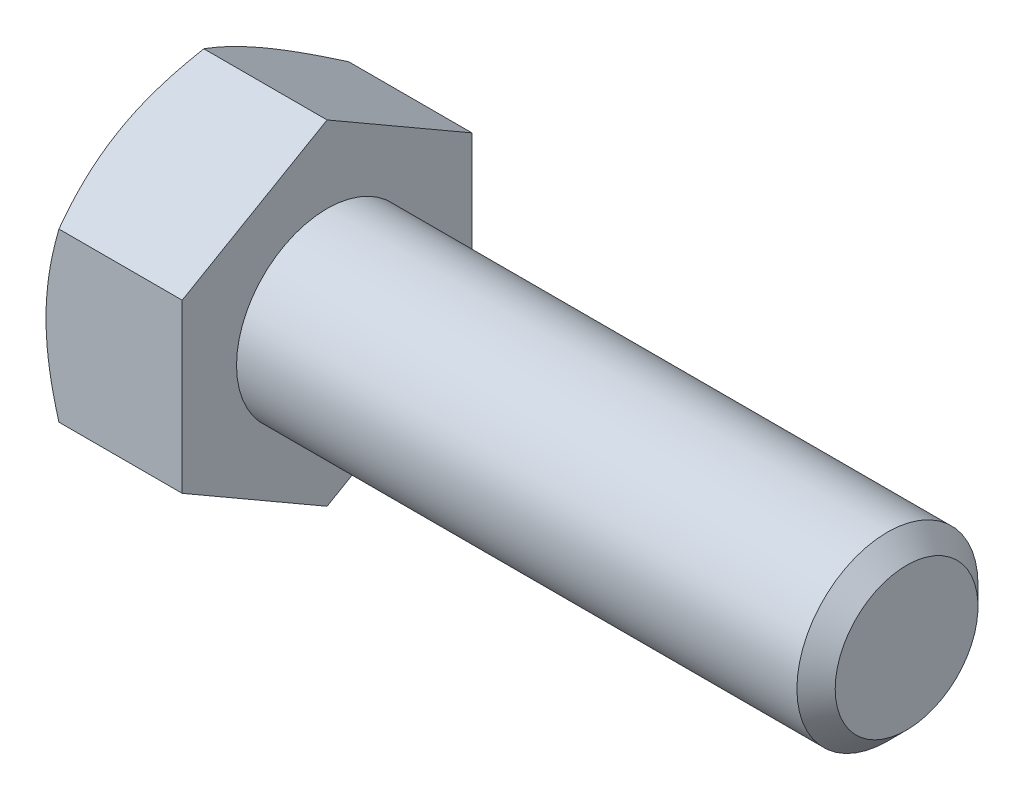
ISO-10303-21;
HEADER;
FILE_DESCRIPTION(('STEP AP214'),'2;1');
FILE_NAME('part.step','',(''),(''),'','','');
FILE_SCHEMA(('AUTOMOTIVE_DESIGN { 1 0 10303 214 1 1 1 1 }'));
ENDSEC;
DATA;
#1=APPLICATION_CONTEXT('core data for automotive mechanical design processes');
#2=APPLICATION_PROTOCOL_DEFINITION('international standard','automotive_design',2000,#1);
#3=PRODUCT_CONTEXT('',#1,'mechanical');
#4=PRODUCT('Part','Part','',(#3));
#5=PRODUCT_RELATED_PRODUCT_CATEGORY('part','',(#4));
#6=PRODUCT_DEFINITION_FORMATION('','',#4);
#7=PRODUCT_DEFINITION_CONTEXT('part definition',#1,'design');
#8=PRODUCT_DEFINITION('design','',#6,#7);
#9=PRODUCT_DEFINITION_SHAPE('','',#8);
#10=(LENGTH_UNIT() NAMED_UNIT(*) SI_UNIT(.MILLI.,.METRE.));
#11=(NAMED_UNIT(*) PLANE_ANGLE_UNIT() SI_UNIT($,.RADIAN.));
#12=(NAMED_UNIT(*) SI_UNIT($,.STERADIAN.) SOLID_ANGLE_UNIT());
#13=UNCERTAINTY_MEASURE_WITH_UNIT(LENGTH_MEASURE(1.E-05),#10,'distance_accuracy_value','');
#14=(GEOMETRIC_REPRESENTATION_CONTEXT(3) GLOBAL_UNCERTAINTY_ASSIGNED_CONTEXT((#13)) GLOBAL_UNIT_ASSIGNED_CONTEXT((#10,
#11,#12)) REPRESENTATION_CONTEXT('',''));
#15=CARTESIAN_POINT('',(0.,0.,0.));
#16=DIRECTION('',(0.,0.,1.));
#17=DIRECTION('',(1.,0.,0.));
#18=AXIS2_PLACEMENT_3D('',#15,#16,#17);
#19=CARTESIAN_POINT('',(5.969,3.66617420935411,-6.34999999999999));
#20=DIRECTION('',(0.,-0.866025403784438,0.500000000000001));
#21=DIRECTION('',(0.,-0.500000000000001,-0.866025403784438));
#22=AXIS2_PLACEMENT_3D('',#19,#20,#21);
#23=PLANE('',#22);
#24=CARTESIAN_POINT('',(0.567225792220655,7.3324638887621,0.000200000000005751));
#25=CARTESIAN_POINT('',(0.520705795885485,7.25187715009446,-0.13938032578861));
#26=CARTESIAN_POINT('',(0.476297032585866,7.17098994497989,-0.279481074729283));
#27=CARTESIAN_POINT('',(0.39228345045239,7.00855864282176,-0.560820342806721));
#28=CARTESIAN_POINT('',(0.352680703976118,6.92701427845871,-0.702059324954447));
#29=CARTESIAN_POINT('',(0.24185882380987,6.68107555195828,-1.12803769480198));
#30=CARTESIAN_POINT('',(0.178824482202445,6.51571038378532,-1.4144585678797));
#31=CARTESIAN_POINT('',(0.104909071695572,6.26824441683673,-1.84308219577881));
#32=CARTESIAN_POINT('',(0.0838526679332001,6.18688302502749,-1.98400426016694));
#33=CARTESIAN_POINT('',(0.0485440446617486,6.02379260806586,-2.26648514857208));
#34=CARTESIAN_POINT('',(0.0342912239672174,5.94206361604021,-2.40804391521191));
#35=CARTESIAN_POINT('',(0.0129530042780789,5.77846368249352,-2.69140731222965));
#36=CARTESIAN_POINT('',(0.00585947102328577,5.69659300817866,-2.83321147979292));
#37=CARTESIAN_POINT('',(-0.00101567917148399,5.53278054688489,-3.11694298566664));
#38=CARTESIAN_POINT('',(-0.000797521989079379,5.45083876218098,-3.2588703200367));
#39=CARTESIAN_POINT('',(0.00985057652705687,5.22634399461134,-3.6477066635007));
#40=CARTESIAN_POINT('',(0.0277266404085307,5.08386449580427,-3.89448839447146));
#41=CARTESIAN_POINT('',(0.0844122058574213,4.79985183690217,-4.38641274968261));
#42=CARTESIAN_POINT('',(0.123241082865863,4.65831967566048,-4.63155364385825));
#43=CARTESIAN_POINT('',(0.220302170250005,4.37373542545026,-5.12446802425624));
#44=CARTESIAN_POINT('',(0.278945624959315,4.23071924628531,-5.37217931287431));
#45=CARTESIAN_POINT('',(0.412042668710679,3.94681968285054,-5.86390778098996));
#46=CARTESIAN_POINT('',(0.486464993107676,3.80593266266769,-6.10793125807364));
#47=CARTESIAN_POINT('',(0.567225792220648,3.66605873930029,-6.3502));
#48=B_SPLINE_CURVE_WITH_KNOTS('',3,(#24,#25,#26,#27,#28,#29,#30,#31,#32,#33,#34,#35,#36,#37,#38,
#39,#40,#41,#42,#43,#44,#45,#46,#47),.UNSPECIFIED.,.F.,.F.,(4,2,2,2,2,2,2,2,2,2,2,4),(0.,
0.503218195050233,1.00665261286994,2.01561339063537,2.507736941055,2.99981699787609,
3.49133733019736,3.98284247815861,4.83850206575153,5.69495425638524,6.57040160519866,
7.44413026658514),.UNSPECIFIED.);
#49=CARTESIAN_POINT('',(0.56715912397921,7.33234841870825,0.));
#50=VERTEX_POINT('',#49);
#51=CARTESIAN_POINT('',(0.,5.49926131403117,-3.17500000000001));
#52=VERTEX_POINT('',#51);
#53=EDGE_CURVE('E63',#50,#52,#48,.T.);
#54=ORIENTED_EDGE('',*,*,#53,.F.);
#55=DIRECTION('',(-1.,0.,0.));
#56=VECTOR('',#55,1.);
#57=CARTESIAN_POINT('',(5.969,7.33234841870825,0.));
#58=LINE('',#57,#56);
#59=CARTESIAN_POINT('',(5.969,7.33234841870825,0.));
#60=VERTEX_POINT('',#59);
#61=EDGE_CURVE('E159',#60,#50,#58,.T.);
#62=ORIENTED_EDGE('',*,*,#61,.F.);
#63=DIRECTION('',(0.,0.500000000000001,0.866025403784438));
#64=VECTOR('',#63,1.);
#65=CARTESIAN_POINT('',(5.969,3.66617420935411,-6.34999999999999));
#66=LINE('',#65,#64);
#67=CARTESIAN_POINT('',(5.969,3.66617420935411,-6.34999999999999));
#68=VERTEX_POINT('',#67);
#69=EDGE_CURVE('E250',#68,#60,#66,.T.);
#70=ORIENTED_EDGE('',*,*,#69,.F.);
#71=DIRECTION('',(-1.,0.,0.));
#72=VECTOR('',#71,1.);
#73=CARTESIAN_POINT('',(5.969,3.66617420935411,-6.34999999999999));
#74=LINE('',#73,#72);
#75=CARTESIAN_POINT('',(0.567159123979203,3.66617420935411,-6.34999999999999));
#76=VERTEX_POINT('',#75);
#77=EDGE_CURVE('E147',#68,#76,#74,.T.);
#78=ORIENTED_EDGE('',*,*,#77,.T.);
#79=EDGE_CURVE('E141',#52,#76,#48,.T.);
#80=ORIENTED_EDGE('',*,*,#79,.F.);
#81=EDGE_LOOP('',(#54,#62,#70,#78,#80));
#82=FACE_BOUND('',#81,.T.);
#83=ADVANCED_FACE('F47',(#82),#23,.F.);
#84=CARTESIAN_POINT('',(5.969,7.33234841870825,0.));
#85=DIRECTION('',(0.,-0.866025403784438,-0.500000000000001));
#86=DIRECTION('',(0.,0.500000000000001,-0.866025403784438));
#87=AXIS2_PLACEMENT_3D('',#84,#85,#86);
#88=PLANE('',#87);
#89=CARTESIAN_POINT('',(0.567225792220651,3.66605873930029,6.3502));
#90=CARTESIAN_POINT('',(0.520705795885481,3.74664547796792,6.21061967421138));
#91=CARTESIAN_POINT('',(0.476297032585862,3.82753268308249,6.0705189252707));
#92=CARTESIAN_POINT('',(0.392283450452386,3.98996398524061,5.78917965719326));
#93=CARTESIAN_POINT('',(0.352680703976115,4.07150834960367,5.64794067504554));
#94=CARTESIAN_POINT('',(0.241858823809868,4.3174470761041,5.22196230519801));
#95=CARTESIAN_POINT('',(0.178824482202444,4.48281224427705,4.93554143212029));
#96=CARTESIAN_POINT('',(0.104909071695573,4.73027821122564,4.50691780422117));
#97=CARTESIAN_POINT('',(0.0838526679332012,4.81163960303488,4.36599573983304));
#98=CARTESIAN_POINT('',(0.0485440446617505,4.97473001999651,4.0835148514279));
#99=CARTESIAN_POINT('',(0.03429122396722,5.05645901202217,3.94195608478808));
#100=CARTESIAN_POINT('',(0.0129530042780825,5.22005894556885,3.65859268777033));
#101=CARTESIAN_POINT('',(0.00585947102328984,5.30192961988371,3.51678852020706));
#102=CARTESIAN_POINT('',(-0.00101567917148005,5.46574208117748,3.23305701433335));
#103=CARTESIAN_POINT('',(-0.000797521989076034,5.5476838658814,3.09112967996329));
#104=CARTESIAN_POINT('',(0.00985057652706057,5.77217863345105,2.7022933364993));
#105=CARTESIAN_POINT('',(0.0277266404085369,5.91465813225811,2.45551160552852));
#106=CARTESIAN_POINT('',(0.0844122058574301,6.1986707911602,1.96358725031737));
#107=CARTESIAN_POINT('',(0.123241082865872,6.34020295240189,1.71844635614173));
#108=CARTESIAN_POINT('',(0.220302170250014,6.62478720261211,1.22553197574374));
#109=CARTESIAN_POINT('',(0.278945624959325,6.76780338177705,0.977820687125676));
#110=CARTESIAN_POINT('',(0.412042668710689,7.05170294521183,0.486092219010024));
#111=CARTESIAN_POINT('',(0.486464993107686,7.19258996539468,0.242068741926349));
#112=CARTESIAN_POINT('',(0.567225792220655,7.3324638887621,-0.000200000000005751));
#113=B_SPLINE_CURVE_WITH_KNOTS('',3,(#89,#90,#91,#92,#93,#94,#95,#96,#97,#98,#99,#100,#101,#102,
#103,#104,#105,#106,#107,#108,#109,#110,#111,#112),.UNSPECIFIED.,.F.,.F.,(4,2,2,2,2,2,2,2,2,2,2,
4),(0.,0.503218195050233,1.00665261286994,2.01561339063537,2.507736941055,2.99981699787609,
3.49133733019736,3.98284247815861,4.83850206575153,5.69495425638524,6.57040160519865,
7.44413026658514),.UNSPECIFIED.);
#114=CARTESIAN_POINT('',(0.567159123979206,3.66617420935411,6.34999999999999));
#115=VERTEX_POINT('',#114);
#116=CARTESIAN_POINT('',(0.,5.49926131403117,3.17500000000001));
#117=VERTEX_POINT('',#116);
#118=EDGE_CURVE('E70',#115,#117,#113,.T.);
#119=ORIENTED_EDGE('',*,*,#118,.F.);
#120=DIRECTION('',(-1.,0.,0.));
#121=VECTOR('',#120,1.);
#122=CARTESIAN_POINT('',(5.969,3.66617420935411,6.34999999999999));
#123=LINE('',#122,#121);
#124=CARTESIAN_POINT('',(5.969,3.66617420935411,6.34999999999999));
#125=VERTEX_POINT('',#124);
#126=EDGE_CURVE('E157',#125,#115,#123,.T.);
#127=ORIENTED_EDGE('',*,*,#126,.F.);
#128=DIRECTION('',(0.,-0.500000000000001,0.866025403784438));
#129=VECTOR('',#128,1.);
#130=CARTESIAN_POINT('',(5.969,7.33234841870825,0.));
#131=LINE('',#130,#129);
#132=EDGE_CURVE('E248',#60,#125,#131,.T.);
#133=ORIENTED_EDGE('',*,*,#132,.F.);
#134=ORIENTED_EDGE('',*,*,#61,.T.);
#135=EDGE_CURVE('E174',#117,#50,#113,.T.);
#136=ORIENTED_EDGE('',*,*,#135,.F.);
#137=EDGE_LOOP('',(#119,#127,#133,#134,#136));
#138=FACE_BOUND('',#137,.T.);
#139=ADVANCED_FACE('F180',(#138),#88,.F.);
#140=CARTESIAN_POINT('',(5.969,3.66617420935411,6.34999999999999));
#141=DIRECTION('',(0.,0.,-1.));
#142=DIRECTION('',(-1.,0.,0.));
#143=AXIS2_PLACEMENT_3D('',#140,#141,#142);
#144=PLANE('',#143);
#145=CARTESIAN_POINT('',(3.14367601755405,-9.93980283198639,6.34999999999999));
#146=CARTESIAN_POINT('',(3.00837198029773,-9.66163438687442,6.34999999999999));
#147=CARTESIAN_POINT('',(2.87433908027309,-9.3828371073051,6.34999999999999));
#148=CARTESIAN_POINT('',(2.60952879037523,-8.8236507491173,6.34999999999999));
#149=CARTESIAN_POINT('',(2.4787518963537,-8.54326143593897,6.34999999999999));
#150=CARTESIAN_POINT('',(2.22052868772129,-7.97915634696427,6.34999999999999));
#151=CARTESIAN_POINT('',(2.09310359186349,-7.695430825227,6.34999999999999));
#152=CARTESIAN_POINT('',(1.84334767414879,-7.12575465379769,6.34999999999999));
#153=CARTESIAN_POINT('',(1.72101661744909,-6.83980410740554,6.34999999999999));
#154=CARTESIAN_POINT('',(1.47885197386771,-6.2557230270762,6.34999999999999));
#155=CARTESIAN_POINT('',(1.35923464654653,-5.9575023498181,6.34999999999999));
#156=CARTESIAN_POINT('',(1.12883238942455,-5.357606094795,6.34999999999999));
#157=CARTESIAN_POINT('',(1.01804843752938,-5.05593013872692,6.34999999999999));
#158=CARTESIAN_POINT('',(0.808153098255225,-4.44917964545297,6.34999999999999));
#159=CARTESIAN_POINT('',(0.709018875842442,-4.14411308466492,6.34999999999999));
#160=CARTESIAN_POINT('',(0.525543834192884,-3.52960171995186,6.34999999999999));
#161=CARTESIAN_POINT('',(0.441198453590938,-3.22015829792944,6.34999999999999));
#162=CARTESIAN_POINT('',(0.291727586386876,-2.59842911342063,6.34999999999999));
#163=CARTESIAN_POINT('',(0.226496888329708,-2.2861690499431,6.34999999999999));
#164=CARTESIAN_POINT('',(0.118904571828099,-1.65762730788837,6.34999999999999));
#165=CARTESIAN_POINT('',(0.0765405573459571,-1.34134605421932,6.34999999999999));
#166=CARTESIAN_POINT('',(0.0329533459299324,-0.867275016888791,6.34999999999999));
#167=CARTESIAN_POINT('',(0.0217606490874758,-0.710363798925241,6.34999999999999));
#168=CARTESIAN_POINT('',(0.00601970866107996,-0.396201526465927,6.34999999999999));
#169=CARTESIAN_POINT('',(0.00147135206032945,-0.238950477796076,6.34999999999999));
#170=CARTESIAN_POINT('',(-0.000864873693707638,0.0756024820110111,6.34999999999999));
#171=CARTESIAN_POINT('',(0.00134730804231018,0.2329043935222,6.34999999999999));
#172=CARTESIAN_POINT('',(0.0124750937047321,0.547273259965611,6.34999999999999));
#173=CARTESIAN_POINT('',(0.0213910154873183,0.704340203403037,6.34999999999999));
#174=CARTESIAN_POINT('',(0.0504634057547403,1.07899586027898,6.34999999999999));
#175=CARTESIAN_POINT('',(0.073643623882215,1.2963550957377,6.34999999999999));
#176=CARTESIAN_POINT('',(0.13159960434819,1.72951065205878,6.34999999999999));
#177=CARTESIAN_POINT('',(0.166376861833684,1.94530676772894,6.34999999999999));
#178=CARTESIAN_POINT('',(0.286264257854856,2.59006925980297,6.34999999999999));
#179=CARTESIAN_POINT('',(0.386910475193505,3.01618787228098,6.34999999999999));
#180=CARTESIAN_POINT('',(0.562116784628249,3.65361272982345,6.34999999999999));
#181=CARTESIAN_POINT('',(0.625415304913837,3.86820484032542,6.34999999999999));
#182=CARTESIAN_POINT('',(0.758751353425599,4.29530575657379,6.34999999999999));
#183=CARTESIAN_POINT('',(0.828788931820656,4.50781454679793,6.34999999999999));
#184=CARTESIAN_POINT('',(0.974465563814957,4.93081468737569,6.34999999999999));
#185=CARTESIAN_POINT('',(1.05010294252176,5.14130661986484,6.34999999999999));
#186=CARTESIAN_POINT('',(1.20607264760708,5.56053331579619,6.34999999999999));
#187=CARTESIAN_POINT('',(1.28640487799369,5.76926811506533,6.34999999999999));
#188=CARTESIAN_POINT('',(1.50347781751132,6.31783828344512,6.34999999999999));
#189=CARTESIAN_POINT('',(1.64351404320344,6.65636817400485,6.34999999999999));
#190=CARTESIAN_POINT('',(1.93147973510731,7.33006601753897,6.34999999999999));
#191=CARTESIAN_POINT('',(2.07940998438119,7.66523363305403,6.34999999999999));
#192=CARTESIAN_POINT('',(2.38134633815376,8.33295246114881,6.34999999999999));
#193=CARTESIAN_POINT('',(2.53535453751782,8.66550272340177,6.34999999999999));
#194=CARTESIAN_POINT('',(2.84803388547347,9.32838207907316,6.34999999999999));
#195=CARTESIAN_POINT('',(3.00670486567662,9.65871125217437,6.34999999999999));
#196=CARTESIAN_POINT('',(3.32795966755859,10.3180684957328,6.34999999999999));
#197=CARTESIAN_POINT('',(3.49054898052716,10.6470938852597,6.34999999999999));
#198=CARTESIAN_POINT('',(3.81866781799735,11.3036759425,6.34999999999999));
#199=CARTESIAN_POINT('',(3.98419736411603,11.6312325993929,6.34999999999999));
#200=CARTESIAN_POINT('',(4.31759864974134,12.2850676249536,6.34999999999999));
#201=CARTESIAN_POINT('',(4.485469913239,12.6113462366288,6.34999999999999));
#202=CARTESIAN_POINT('',(4.82315890277016,13.2628952011191,6.34999999999999));
#203=CARTESIAN_POINT('',(4.99297663652367,13.5881655499287,6.34999999999999));
#204=CARTESIAN_POINT('',(5.47018031685674,14.4967378639502,6.34999999999999));
#205=CARTESIAN_POINT('',(5.77935148177737,15.0791020152927,6.34999999999999));
#206=CARTESIAN_POINT('',(6.40147296847068,16.2418453877031,6.34999999999999));
#207=CARTESIAN_POINT('',(6.71442349983111,16.8222244963774,6.34999999999999));
#208=CARTESIAN_POINT('',(7.34215184678352,17.9796171047036,6.34999999999999));
#209=CARTESIAN_POINT('',(7.65692074956546,18.5566354431591,6.34999999999999));
#210=CARTESIAN_POINT('',(8.28862904640648,19.7094283212459,6.34999999999999));
#211=CARTESIAN_POINT('',(8.60556827976312,20.2852029489025,6.34999999999999));
#212=CARTESIAN_POINT('',(8.92329906980365,20.8605372016132,6.34999999999999));
#213=B_SPLINE_CURVE_WITH_KNOTS('',3,(#145,#146,#147,#148,#149,#150,#151,#152,#153,#154,#155,
#156,#157,#158,#159,#160,#161,#162,#163,#164,#165,#166,#167,#168,#169,#170,#171,#172,#173,#174,
#175,#176,#177,#178,#179,#180,#181,#182,#183,#184,#185,#186,#187,#188,#189,#190,#191,#192,#193,
#194,#195,#196,#197,#198,#199,#200,#201,#202,#203,#204,#205,#206,#207,#208,#209,#210,#211,#212),
.UNSPECIFIED.,.F.,.F.,(4,2,2,2,2,2,2,2,2,2,2,2,2,2,2,2,2,2,2,2,2,2,2,2,2,2,2,2,2,2,2,2,2,4),(0.,
0.92800002577165,1.85614052122796,2.78917912474405,3.72217466606163,4.68601414241722,
5.64996017364174,6.61198406033347,7.57371070325733,8.53003982946587,9.48626872926092,
9.95807916799837,10.4298815813894,10.9016875462366,11.3735158830582,12.0289230702765,
12.6844147884824,13.9960635141582,14.6672040909619,15.338349664455,16.0092953039748,
16.6802272299963,17.7791313314936,18.8781446441682,19.9775401158916,21.0768959334804,
22.1778940812193,23.2789003270287,24.379685937715,25.480475915801,27.4584871219283,
29.4366085285952,31.408472007269,33.380191024666),.UNSPECIFIED.);
#214=CARTESIAN_POINT('',(0.567159123979206,-3.66617420935411,6.34999999999999));
#215=VERTEX_POINT('',#214);
#216=CARTESIAN_POINT('',(0.,0.,6.34999999999999));
#217=VERTEX_POINT('',#216);
#218=EDGE_CURVE('E260',#215,#217,#213,.T.);
#219=ORIENTED_EDGE('',*,*,#218,.F.);
#220=DIRECTION('',(-1.,0.,0.));
#221=VECTOR('',#220,1.);
#222=CARTESIAN_POINT('',(5.969,-3.66617420935411,6.34999999999999));
#223=LINE('',#222,#221);
#224=CARTESIAN_POINT('',(5.969,-3.66617420935411,6.34999999999999));
#225=VERTEX_POINT('',#224);
#226=EDGE_CURVE('E149',#225,#215,#223,.T.);
#227=ORIENTED_EDGE('',*,*,#226,.F.);
#228=DIRECTION('',(0.,-1.,0.));
#229=VECTOR('',#228,1.);
#230=CARTESIAN_POINT('',(5.969,3.66617420935411,6.34999999999999));
#231=LINE('',#230,#229);
#232=EDGE_CURVE('E244',#125,#225,#231,.T.);
#233=ORIENTED_EDGE('',*,*,#232,.F.);
#234=ORIENTED_EDGE('',*,*,#126,.T.);
#235=EDGE_CURVE('E198',#217,#115,#213,.T.);
#236=ORIENTED_EDGE('',*,*,#235,.F.);
#237=EDGE_LOOP('',(#219,#227,#233,#234,#236));
#238=FACE_BOUND('',#237,.T.);
#239=ADVANCED_FACE('F266',(#238),#144,.F.);
#240=CARTESIAN_POINT('',(5.969,-7.33234841870825,0.));
#241=DIRECTION('',(0.,0.866025403784437,-0.500000000000002));
#242=DIRECTION('',(0.,0.500000000000002,0.866025403784438));
#243=AXIS2_PLACEMENT_3D('',#240,#241,#242);
#244=PLANE('',#243);
#245=CARTESIAN_POINT('',(0.567225792220658,-7.3324638887621,-0.000200000000005751));
#246=CARTESIAN_POINT('',(0.520705795885488,-7.25187715009446,0.139380325788611));
#247=CARTESIAN_POINT('',(0.476297032585869,-7.17098994497989,0.279481074729286));
#248=CARTESIAN_POINT('',(0.392283450452392,-7.00855864282177,0.560820342806725));
#249=CARTESIAN_POINT('',(0.35268070397612,-6.92701427845871,0.702059324954451));
#250=CARTESIAN_POINT('',(0.241858823809873,-6.68107555195828,1.12803769480198));
#251=CARTESIAN_POINT('',(0.178824482202448,-6.51571038378533,1.4144585678797));
#252=CARTESIAN_POINT('',(0.104909071695575,-6.26824441683674,1.84308219577882));
#253=CARTESIAN_POINT('',(0.0838526679332025,-6.1868830250275,1.98400426016694));
#254=CARTESIAN_POINT('',(0.048544044661751,-6.02379260806586,2.26648514857208));
#255=CARTESIAN_POINT('',(0.0342912239672204,-5.94206361604021,2.40804391521191));
#256=CARTESIAN_POINT('',(0.0129530042780814,-5.77846368249352,2.69140731222966));
#257=CARTESIAN_POINT('',(0.00585947102328738,-5.69659300817866,2.83321147979292));
#258=CARTESIAN_POINT('',(-0.00101567917148209,-5.53278054688489,3.11694298566664));
#259=CARTESIAN_POINT('',(-0.000797521989076305,-5.45083876218098,3.2588703200367));
#260=CARTESIAN_POINT('',(0.00985057652706104,-5.22634399461134,3.6477066635007));
#261=CARTESIAN_POINT('',(0.0277266404085333,-5.08386449580427,3.89448839447146));
#262=CARTESIAN_POINT('',(0.0844122058574222,-4.79985183690217,4.38641274968261));
#263=CARTESIAN_POINT('',(0.123241082865864,-4.65831967566048,4.63155364385826));
#264=CARTESIAN_POINT('',(0.220302170250005,-4.37373542545026,5.12446802425625));
#265=CARTESIAN_POINT('',(0.278945624959315,-4.23071924628532,5.37217931287431));
#266=CARTESIAN_POINT('',(0.41204266871068,-3.94681968285054,5.86390778098996));
#267=CARTESIAN_POINT('',(0.486464993107677,-3.80593266266769,6.10793125807364));
#268=CARTESIAN_POINT('',(0.567225792220651,-3.66605873930029,6.3502));
#269=B_SPLINE_CURVE_WITH_KNOTS('',3,(#245,#246,#247,#248,#249,#250,#251,#252,#253,#254,#255,
#256,#257,#258,#259,#260,#261,#262,#263,#264,#265,#266,#267,#268),.UNSPECIFIED.,.F.,.F.,(4,2,2,
2,2,2,2,2,2,2,2,4),(0.,0.503218195050234,1.00665261286995,2.01561339063537,2.507736941055,
2.99981699787609,3.49133733019736,3.98284247815861,4.83850206575153,5.69495425638524,
6.57040160519865,7.44413026658514),.UNSPECIFIED.);
#270=CARTESIAN_POINT('',(0.567159123979213,-7.33234841870825,0.));
#271=VERTEX_POINT('',#270);
#272=CARTESIAN_POINT('',(0.,-5.49926131403117,3.17500000000001));
#273=VERTEX_POINT('',#272);
#274=EDGE_CURVE('E182',#271,#273,#269,.T.);
#275=ORIENTED_EDGE('',*,*,#274,.F.);
#276=DIRECTION('',(-1.,0.,0.));
#277=VECTOR('',#276,1.);
#278=CARTESIAN_POINT('',(5.969,-7.33234841870825,0.));
#279=LINE('',#278,#277);
#280=CARTESIAN_POINT('',(5.969,-7.33234841870825,0.));
#281=VERTEX_POINT('',#280);
#282=EDGE_CURVE('E146',#281,#271,#279,.T.);
#283=ORIENTED_EDGE('',*,*,#282,.F.);
#284=DIRECTION('',(0.,-0.500000000000002,-0.866025403784437));
#285=VECTOR('',#284,1.);
#286=CARTESIAN_POINT('',(5.969,-7.33234841870825,0.));
#287=LINE('',#286,#285);
#288=EDGE_CURVE('E242',#225,#281,#287,.T.);
#289=ORIENTED_EDGE('',*,*,#288,.F.);
#290=ORIENTED_EDGE('',*,*,#226,.T.);
#291=EDGE_CURVE('E184',#273,#215,#269,.T.);
#292=ORIENTED_EDGE('',*,*,#291,.F.);
#293=EDGE_LOOP('',(#275,#283,#289,#290,#292));
#294=FACE_BOUND('',#293,.T.);
#295=ADVANCED_FACE('F238',(#294),#244,.F.);
#296=CARTESIAN_POINT('',(5.969,-3.66617420935414,-6.34999999999999));
#297=DIRECTION('',(0.,0.866025403784438,0.500000000000001));
#298=DIRECTION('',(0.,-0.500000000000001,0.866025403784438));
#299=AXIS2_PLACEMENT_3D('',#296,#297,#298);
#300=PLANE('',#299);
#301=CARTESIAN_POINT('',(0.567225792220655,-3.66605873930029,-6.3502));
#302=CARTESIAN_POINT('',(0.520705795885487,-3.74664547796793,-6.21061967421138));
#303=CARTESIAN_POINT('',(0.476297032585869,-3.8275326830825,-6.07051892527071));
#304=CARTESIAN_POINT('',(0.392283450452394,-3.98996398524062,-5.78917965719327));
#305=CARTESIAN_POINT('',(0.352680703976123,-4.07150834960368,-5.64794067504554));
#306=CARTESIAN_POINT('',(0.241858823809876,-4.31744707610411,-5.22196230519801));
#307=CARTESIAN_POINT('',(0.178824482202452,-4.48281224427706,-4.93554143212029));
#308=CARTESIAN_POINT('',(0.10490907169558,-4.73027821122565,-4.50691780422117));
#309=CARTESIAN_POINT('',(0.083852667933209,-4.81163960303489,-4.36599573983305));
#310=CARTESIAN_POINT('',(0.0485440446617586,-4.97473001999652,-4.08351485142791));
#311=CARTESIAN_POINT('',(0.0342912239672283,-5.05645901202218,-3.94195608478808));
#312=CARTESIAN_POINT('',(0.0129530042780912,-5.22005894556886,-3.65859268777033));
#313=CARTESIAN_POINT('',(0.00585947102329886,-5.30192961988373,-3.51678852020707));
#314=CARTESIAN_POINT('',(-0.00101567917147331,-5.46574208117749,-3.23305701433335));
#315=CARTESIAN_POINT('',(-0.000797521989071886,-5.54768386588141,-3.09112967996329));
#316=CARTESIAN_POINT('',(0.00985057652706285,-5.77217863345105,-2.7022933364993));
#317=CARTESIAN_POINT('',(0.0277266404085438,-5.91465813225811,-2.45551160552853));
#318=CARTESIAN_POINT('',(0.0844122058574396,-6.19867079116021,-1.96358725031738));
#319=CARTESIAN_POINT('',(0.123241082865879,-6.3402029524019,-1.71844635614173));
#320=CARTESIAN_POINT('',(0.220302170250021,-6.62478720261212,-1.22553197574375));
#321=CARTESIAN_POINT('',(0.278945624959332,-6.76780338177707,-0.977820687125684));
#322=CARTESIAN_POINT('',(0.412042668710697,-7.05170294521184,-0.486092219010031));
#323=CARTESIAN_POINT('',(0.486464993107693,-7.19258996539469,-0.242068741926354));
#324=CARTESIAN_POINT('',(0.567225792220658,-7.3324638887621,0.000200000000005751));
#325=B_SPLINE_CURVE_WITH_KNOTS('',3,(#301,#302,#303,#304,#305,#306,#307,#308,#309,#310,#311,
#312,#313,#314,#315,#316,#317,#318,#319,#320,#321,#322,#323,#324),.UNSPECIFIED.,.F.,.F.,(4,2,2,
2,2,2,2,2,2,2,2,4),(0.,0.503218195050233,1.00665261286994,2.01561339063537,2.507736941055,
2.99981699787609,3.49133733019736,3.98284247815861,4.83850206575153,5.69495425638523,
6.57040160519865,7.44413026658514),.UNSPECIFIED.);
#326=CARTESIAN_POINT('',(0.567159123978884,-3.66617420935461,-6.34999999999999));
#327=VERTEX_POINT('',#326);
#328=CARTESIAN_POINT('',(0.,-5.4992613140312,-3.17500000000001));
#329=VERTEX_POINT('',#328);
#330=EDGE_CURVE('E123',#327,#329,#325,.T.);
#331=ORIENTED_EDGE('',*,*,#330,.F.);
#332=DIRECTION('',(-1.,0.,0.));
#333=VECTOR('',#332,1.);
#334=CARTESIAN_POINT('',(5.969,-3.66617420935414,-6.34999999999999));
#335=LINE('',#334,#333);
#336=CARTESIAN_POINT('',(5.969,-3.66617420935414,-6.34999999999999));
#337=VERTEX_POINT('',#336);
#338=EDGE_CURVE('E137',#337,#327,#335,.T.);
#339=ORIENTED_EDGE('',*,*,#338,.F.);
#340=DIRECTION('',(0.,0.500000000000001,-0.866025403784438));
#341=VECTOR('',#340,1.);
#342=CARTESIAN_POINT('',(5.969,-3.66617420935414,-6.34999999999999));
#343=LINE('',#342,#341);
#344=EDGE_CURVE('E240',#281,#337,#343,.T.);
#345=ORIENTED_EDGE('',*,*,#344,.F.);
#346=ORIENTED_EDGE('',*,*,#282,.T.);
#347=EDGE_CURVE('E140',#329,#271,#325,.T.);
#348=ORIENTED_EDGE('',*,*,#347,.F.);
#349=EDGE_LOOP('',(#331,#339,#345,#346,#348));
#350=FACE_BOUND('',#349,.T.);
#351=ADVANCED_FACE('F135',(#350),#300,.F.);
#352=CARTESIAN_POINT('',(5.969,3.66617420935411,-6.34999999999999));
#353=DIRECTION('',(0.,0.,1.));
#354=DIRECTION('',(1.,0.,0.));
#355=AXIS2_PLACEMENT_3D('',#352,#353,#354);
#356=PLANE('',#355);
#357=CARTESIAN_POINT('',(3.14367601755406,-9.93980283198642,-6.34999999999999));
#358=CARTESIAN_POINT('',(3.00837198029774,-9.66163438687445,-6.34999999999999));
#359=CARTESIAN_POINT('',(2.8743390802731,-9.38283710730513,-6.34999999999999));
#360=CARTESIAN_POINT('',(2.60952879037524,-8.82365074911733,-6.34999999999999));
#361=CARTESIAN_POINT('',(2.47875189635371,-8.543261435939,-6.34999999999999));
#362=CARTESIAN_POINT('',(2.2205286877213,-7.9791563469643,-6.34999999999999));
#363=CARTESIAN_POINT('',(2.0931035918635,-7.69543082522702,-6.34999999999999));
#364=CARTESIAN_POINT('',(1.8433476741488,-7.1257546537977,-6.34999999999999));
#365=CARTESIAN_POINT('',(1.7210166174491,-6.83980410740556,-6.34999999999999));
#366=CARTESIAN_POINT('',(1.47885197386772,-6.25572302707622,-6.34999999999999));
#367=CARTESIAN_POINT('',(1.35923464654653,-5.95750234981811,-6.34999999999999));
#368=CARTESIAN_POINT('',(1.12883238942456,-5.35760609479502,-6.34999999999999));
#369=CARTESIAN_POINT('',(1.01804843752939,-5.05593013872693,-6.34999999999999));
#370=CARTESIAN_POINT('',(0.808153098255228,-4.44917964545298,-6.34999999999999));
#371=CARTESIAN_POINT('',(0.709018875842444,-4.14411308466492,-6.34999999999999));
#372=CARTESIAN_POINT('',(0.525543834192886,-3.52960171995186,-6.34999999999999));
#373=CARTESIAN_POINT('',(0.441198453590942,-3.22015829792944,-6.34999999999999));
#374=CARTESIAN_POINT('',(0.29172758638688,-2.59842911342063,-6.34999999999999));
#375=CARTESIAN_POINT('',(0.226496888329708,-2.2861690499431,-6.34999999999999));
#376=CARTESIAN_POINT('',(0.118904571828098,-1.65762730788837,-6.34999999999999));
#377=CARTESIAN_POINT('',(0.0765405573459568,-1.34134605421932,-6.34999999999999));
#378=CARTESIAN_POINT('',(0.0329533459299325,-0.86727501688879,-6.34999999999999));
#379=CARTESIAN_POINT('',(0.0217606490874759,-0.71036379892524,-6.34999999999999));
#380=CARTESIAN_POINT('',(0.00601970866107992,-0.396201526465926,-6.34999999999999));
#381=CARTESIAN_POINT('',(0.00147135206032945,-0.238950477796075,-6.34999999999999));
#382=CARTESIAN_POINT('',(-0.00086487369370763,0.0756024820110125,-6.34999999999999));
#383=CARTESIAN_POINT('',(0.00134730804231017,0.232904393522202,-6.34999999999999));
#384=CARTESIAN_POINT('',(0.0124750937047321,0.547273259965612,-6.34999999999999));
#385=CARTESIAN_POINT('',(0.0213910154873183,0.704340203403038,-6.34999999999999));
#386=CARTESIAN_POINT('',(0.0504634057547403,1.07899586027898,-6.34999999999999));
#387=CARTESIAN_POINT('',(0.0736436238822149,1.2963550957377,-6.34999999999999));
#388=CARTESIAN_POINT('',(0.131599604348189,1.72951065205877,-6.34999999999999));
#389=CARTESIAN_POINT('',(0.166376861833682,1.94530676772893,-6.34999999999999));
#390=CARTESIAN_POINT('',(0.286264257854853,2.59006925980296,-6.34999999999999));
#391=CARTESIAN_POINT('',(0.386910475193502,3.01618787228097,-6.34999999999999));
#392=CARTESIAN_POINT('',(0.562116784628245,3.65361272982343,-6.34999999999999));
#393=CARTESIAN_POINT('',(0.625415304913832,3.8682048403254,-6.34999999999999));
#394=CARTESIAN_POINT('',(0.758751353425593,4.29530575657377,-6.34999999999999));
#395=CARTESIAN_POINT('',(0.82878893182065,4.50781454679791,-6.34999999999999));
#396=CARTESIAN_POINT('',(0.974465563814949,4.93081468737566,-6.34999999999999));
#397=CARTESIAN_POINT('',(1.05010294252175,5.14130661986482,-6.34999999999999));
#398=CARTESIAN_POINT('',(1.20607264760707,5.56053331579616,-6.34999999999999));
#399=CARTESIAN_POINT('',(1.28640487799368,5.7692681150653,-6.34999999999999));
#400=CARTESIAN_POINT('',(1.50347781751131,6.31783828344509,-6.34999999999999));
#401=CARTESIAN_POINT('',(1.64351404320343,6.65636817400483,-6.34999999999999));
#402=CARTESIAN_POINT('',(1.9314797351073,7.33006601753895,-6.34999999999999));
#403=CARTESIAN_POINT('',(2.07940998438118,7.66523363305401,-6.34999999999999));
#404=CARTESIAN_POINT('',(2.38134633815375,8.3329524611488,-6.34999999999999));
#405=CARTESIAN_POINT('',(2.53535453751782,8.66550272340175,-6.34999999999999));
#406=CARTESIAN_POINT('',(2.84803388547347,9.32838207907314,-6.34999999999999));
#407=CARTESIAN_POINT('',(3.00670486567662,9.65871125217435,-6.34999999999999));
#408=CARTESIAN_POINT('',(3.32795966755858,10.3180684957328,-6.34999999999999));
#409=CARTESIAN_POINT('',(3.49054898052716,10.6470938852597,-6.34999999999999));
#410=CARTESIAN_POINT('',(3.81866781799734,11.3036759425,-6.34999999999999));
#411=CARTESIAN_POINT('',(3.98419736411603,11.6312325993928,-6.34999999999999));
#412=CARTESIAN_POINT('',(4.31759864974133,12.2850676249535,-6.34999999999999));
#413=CARTESIAN_POINT('',(4.48546991323899,12.6113462366288,-6.34999999999999));
#414=CARTESIAN_POINT('',(4.82315890277016,13.2628952011191,-6.34999999999999));
#415=CARTESIAN_POINT('',(4.99297663652367,13.5881655499287,-6.34999999999999));
#416=CARTESIAN_POINT('',(5.47018031685674,14.4967378639502,-6.34999999999999));
#417=CARTESIAN_POINT('',(5.77935148177737,15.0791020152927,-6.34999999999999));
#418=CARTESIAN_POINT('',(6.40147296847068,16.2418453877031,-6.34999999999999));
#419=CARTESIAN_POINT('',(6.71442349983111,16.8222244963774,-6.34999999999999));
#420=CARTESIAN_POINT('',(7.34215184678352,17.9796171047036,-6.34999999999999));
#421=CARTESIAN_POINT('',(7.65692074956546,18.5566354431591,-6.34999999999999));
#422=CARTESIAN_POINT('',(8.28862904640648,19.7094283212458,-6.34999999999999));
#423=CARTESIAN_POINT('',(8.60556827976312,20.2852029489025,-6.34999999999999));
#424=CARTESIAN_POINT('',(8.92329906980364,20.8605372016132,-6.34999999999999));
#425=B_SPLINE_CURVE_WITH_KNOTS('',3,(#357,#358,#359,#360,#361,#362,#363,#364,#365,#366,#367,
#368,#369,#370,#371,#372,#373,#374,#375,#376,#377,#378,#379,#380,#381,#382,#383,#384,#385,#386,
#387,#388,#389,#390,#391,#392,#393,#394,#395,#396,#397,#398,#399,#400,#401,#402,#403,#404,#405,
#406,#407,#408,#409,#410,#411,#412,#413,#414,#415,#416,#417,#418,#419,#420,#421,#422,#423,#424),
.UNSPECIFIED.,.F.,.F.,(4,2,2,2,2,2,2,2,2,2,2,2,2,2,2,2,2,2,2,2,2,2,2,2,2,2,2,2,2,2,2,2,2,4),(0.,
0.928000025771651,1.85614052122796,2.78917912474405,3.72217466606164,4.68601414241724,
5.64996017364176,6.61198406033349,7.57371070325735,8.5300398294659,9.48626872926095,
9.9580791679984,10.4298815813894,10.9016875462366,11.3735158830582,12.0289230702765,
12.6844147884825,13.9960635141582,14.6672040909619,15.338349664455,16.0092953039748,
16.6802272299963,17.7791313314936,18.8781446441682,19.9775401158916,21.0768959334805,
22.1778940812193,23.2789003270287,24.379685937715,25.480475915801,27.4584871219283,
29.4366085285952,31.408472007269,33.380191024666),.UNSPECIFIED.);
#426=CARTESIAN_POINT('',(0.,0.,-6.34999999999999));
#427=VERTEX_POINT('',#426);
#428=EDGE_CURVE('E129',#76,#427,#425,.F.);
#429=ORIENTED_EDGE('',*,*,#428,.F.);
#430=ORIENTED_EDGE('',*,*,#77,.F.);
#431=DIRECTION('',(0.,1.,0.));
#432=VECTOR('',#431,1.);
#433=CARTESIAN_POINT('',(5.969,3.66617420935411,-6.34999999999999));
#434=LINE('',#433,#432);
#435=EDGE_CURVE('E145',#337,#68,#434,.T.);
#436=ORIENTED_EDGE('',*,*,#435,.F.);
#437=ORIENTED_EDGE('',*,*,#338,.T.);
#438=EDGE_CURVE('E120',#427,#327,#425,.F.);
#439=ORIENTED_EDGE('',*,*,#438,.F.);
#440=EDGE_LOOP('',(#429,#430,#436,#437,#439));
#441=FACE_BOUND('',#440,.T.);
#442=ADVANCED_FACE('F143',(#441),#356,.F.);
#443=CARTESIAN_POINT('',(5.969,7.33234841870825,0.));
#444=DIRECTION('',(1.,0.,0.));
#445=DIRECTION('',(0.,0.,-1.));
#446=AXIS2_PLACEMENT_3D('',#443,#444,#445);
#447=PLANE('',#446);
#448=CARTESIAN_POINT('',(5.969,0.,0.));
#449=DIRECTION('',(1.,0.,0.));
#450=DIRECTION('',(0.,0.,-1.));
#451=AXIS2_PLACEMENT_3D('',#448,#449,#450);
#452=CIRCLE('',#451,3.96875);
#453=CARTESIAN_POINT('',(5.969,0.,-3.96875));
#454=VERTEX_POINT('',#453);
#455=EDGE_CURVE('E253',#454,#454,#452,.F.);
#456=ORIENTED_EDGE('',*,*,#455,.T.);
#457=EDGE_LOOP('',(#456));
#458=FACE_BOUND('',#457,.T.);
#459=ORIENTED_EDGE('',*,*,#69,.T.);
#460=ORIENTED_EDGE('',*,*,#132,.T.);
#461=ORIENTED_EDGE('',*,*,#232,.T.);
#462=ORIENTED_EDGE('',*,*,#288,.T.);
#463=ORIENTED_EDGE('',*,*,#344,.T.);
#464=ORIENTED_EDGE('',*,*,#435,.T.);
#465=EDGE_LOOP('',(#459,#460,#461,#462,#463,#464));
#466=FACE_BOUND('',#465,.T.);
#467=ADVANCED_FACE('F268',(#458,#466),#447,.T.);
#468=CARTESIAN_POINT('',(0.,0.,0.));
#469=DIRECTION('',(-1.,0.,0.));
#470=DIRECTION('',(0.,0.,1.));
#471=AXIS2_PLACEMENT_3D('',#468,#469,#470);
#472=CYLINDRICAL_SURFACE('',#471,3.96875);
#473=ORIENTED_EDGE('',*,*,#455,.F.);
#474=EDGE_LOOP('',(#473));
#475=FACE_BOUND('',#474,.T.);
#476=CARTESIAN_POINT('',(30.52953,0.,0.));
#477=DIRECTION('',(-1.,0.,0.));
#478=DIRECTION('',(0.,0.,1.));
#479=AXIS2_PLACEMENT_3D('',#476,#477,#478);
#480=CIRCLE('',#479,3.96875);
#481=CARTESIAN_POINT('',(30.52953,0.,3.96875));
#482=VERTEX_POINT('',#481);
#483=EDGE_CURVE('E256',#482,#482,#480,.T.);
#484=ORIENTED_EDGE('',*,*,#483,.T.);
#485=EDGE_LOOP('',(#484));
#486=FACE_BOUND('',#485,.T.);
#487=ADVANCED_FACE('F299',(#475,#486),#472,.T.);
#488=CARTESIAN_POINT('',(31.369,0.,0.));
#489=DIRECTION('',(-1.,0.,0.));
#490=DIRECTION('',(0.,0.,1.));
#491=AXIS2_PLACEMENT_3D('',#488,#489,#490);
#492=CONICAL_SURFACE('',#491,3.12928,0.785398163397439);
#493=ORIENTED_EDGE('',*,*,#483,.F.);
#494=EDGE_LOOP('',(#493));
#495=FACE_BOUND('',#494,.T.);
#496=CARTESIAN_POINT('',(31.369,0.,0.));
#497=DIRECTION('',(-1.,0.,0.));
#498=DIRECTION('',(0.,0.,1.));
#499=AXIS2_PLACEMENT_3D('',#496,#497,#498);
#500=CIRCLE('',#499,3.12928);
#501=CARTESIAN_POINT('',(31.369,0.,3.12928));
#502=VERTEX_POINT('',#501);
#503=EDGE_CURVE('E258',#502,#502,#500,.T.);
#504=ORIENTED_EDGE('',*,*,#503,.T.);
#505=EDGE_LOOP('',(#504));
#506=FACE_BOUND('',#505,.T.);
#507=ADVANCED_FACE('F302',(#495,#506),#492,.T.);
#508=CARTESIAN_POINT('',(31.369,0.,0.));
#509=DIRECTION('',(-1.,0.,0.));
#510=DIRECTION('',(0.,0.,1.));
#511=AXIS2_PLACEMENT_3D('',#508,#509,#510);
#512=PLANE('',#511);
#513=ORIENTED_EDGE('',*,*,#503,.F.);
#514=EDGE_LOOP('',(#513));
#515=FACE_BOUND('',#514,.T.);
#516=ADVANCED_FACE('F212',(#515),#512,.F.);
#517=CARTESIAN_POINT('',(0.,0.,0.));
#518=DIRECTION('',(1.,0.,0.));
#519=DIRECTION('',(0.,0.,-1.));
#520=AXIS2_PLACEMENT_3D('',#517,#518,#519);
#521=CONICAL_SURFACE('',#520,6.35,1.0471975511966);
#522=ORIENTED_EDGE('',*,*,#330,.T.);
#523=CARTESIAN_POINT('',(0.,0.,0.));
#524=DIRECTION('',(1.,0.,0.));
#525=DIRECTION('',(0.,0.,-1.));
#526=AXIS2_PLACEMENT_3D('',#523,#524,#525);
#527=CIRCLE('',#526,6.35);
#528=EDGE_CURVE('E51',#329,#427,#527,.T.);
#529=ORIENTED_EDGE('',*,*,#528,.T.);
#530=ORIENTED_EDGE('',*,*,#438,.T.);
#531=EDGE_LOOP('',(#522,#529,#530));
#532=FACE_BOUND('',#531,.T.);
#533=ADVANCED_FACE('F122',(#532),#521,.T.);
#534=ORIENTED_EDGE('',*,*,#274,.T.);
#535=EDGE_CURVE('E164',#273,#329,#527,.T.);
#536=ORIENTED_EDGE('',*,*,#535,.T.);
#537=ORIENTED_EDGE('',*,*,#347,.T.);
#538=EDGE_LOOP('',(#534,#536,#537));
#539=FACE_BOUND('',#538,.T.);
#540=ADVANCED_FACE('F211',(#539),#521,.T.);
#541=ORIENTED_EDGE('',*,*,#218,.T.);
#542=EDGE_CURVE('E165',#217,#273,#527,.T.);
#543=ORIENTED_EDGE('',*,*,#542,.T.);
#544=ORIENTED_EDGE('',*,*,#291,.T.);
#545=EDGE_LOOP('',(#541,#543,#544));
#546=FACE_BOUND('',#545,.T.);
#547=ADVANCED_FACE('F206',(#546),#521,.T.);
#548=ORIENTED_EDGE('',*,*,#235,.T.);
#549=ORIENTED_EDGE('',*,*,#118,.T.);
#550=CARTESIAN_POINT('',(0.,0.,0.));
#551=DIRECTION('',(-1.,0.,0.));
#552=DIRECTION('',(0.,0.,1.));
#553=AXIS2_PLACEMENT_3D('',#550,#551,#552);
#554=CIRCLE('',#553,6.35);
#555=EDGE_CURVE('E130',#217,#117,#554,.T.);
#556=ORIENTED_EDGE('',*,*,#555,.F.);
#557=EDGE_LOOP('',(#548,#549,#556));
#558=FACE_BOUND('',#557,.T.);
#559=ADVANCED_FACE('F210',(#558),#521,.T.);
#560=ORIENTED_EDGE('',*,*,#135,.T.);
#561=ORIENTED_EDGE('',*,*,#53,.T.);
#562=EDGE_CURVE('E56',#52,#117,#527,.T.);
#563=ORIENTED_EDGE('',*,*,#562,.T.);
#564=EDGE_LOOP('',(#560,#561,#563));
#565=FACE_BOUND('',#564,.T.);
#566=ADVANCED_FACE('F173',(#565),#521,.T.);
#567=ORIENTED_EDGE('',*,*,#79,.T.);
#568=ORIENTED_EDGE('',*,*,#428,.T.);
#569=EDGE_CURVE('E13',#427,#52,#527,.T.);
#570=ORIENTED_EDGE('',*,*,#569,.T.);
#571=EDGE_LOOP('',(#567,#568,#570));
#572=FACE_BOUND('',#571,.T.);
#573=ADVANCED_FACE('F271',(#572),#521,.T.);
#574=CARTESIAN_POINT('',(0.,7.33234841870825,0.));
#575=DIRECTION('',(1.,0.,0.));
#576=DIRECTION('',(0.,0.,-1.));
#577=AXIS2_PLACEMENT_3D('',#574,#575,#576);
#578=PLANE('',#577);
#579=ORIENTED_EDGE('',*,*,#569,.F.);
#580=ORIENTED_EDGE('',*,*,#528,.F.);
#581=ORIENTED_EDGE('',*,*,#535,.F.);
#582=ORIENTED_EDGE('',*,*,#542,.F.);
#583=ORIENTED_EDGE('',*,*,#555,.T.);
#584=ORIENTED_EDGE('',*,*,#562,.F.);
#585=EDGE_LOOP('',(#579,#580,#581,#582,#583,#584));
#586=FACE_BOUND('',#585,.T.);
#587=ADVANCED_FACE('F177',(#586),#578,.F.);
#588=CLOSED_SHELL('',(#83,#139,#239,#295,#351,#442,#467,#487,#507,#516,#533,#540,#547,#559,#566,
#573,#587));
#589=MANIFOLD_SOLID_BREP('B2',#588);
#590=ADVANCED_BREP_SHAPE_REPRESENTATION('',(#18,#589),#14);
#591=SHAPE_DEFINITION_REPRESENTATION(#9,#590);
ENDSEC;
END-ISO-10303-21;
